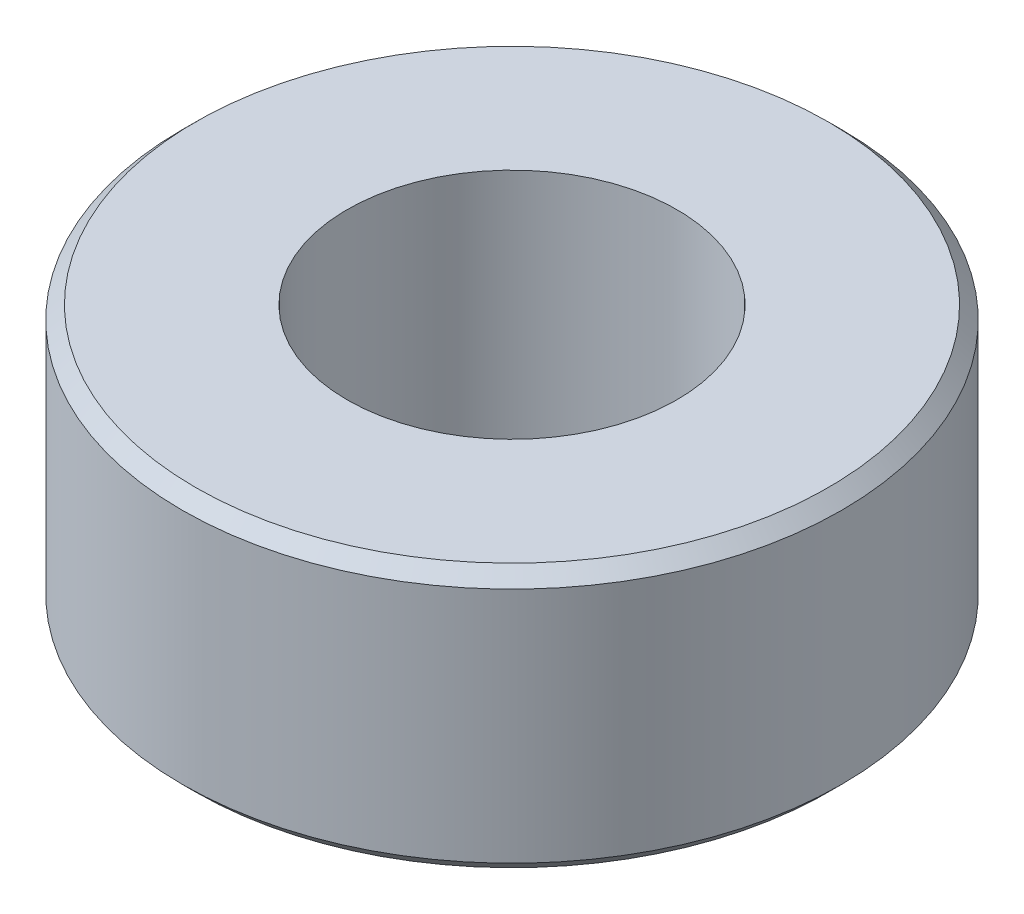
ISO-10303-21;
HEADER;
FILE_DESCRIPTION(('STEP AP214'),'2;1');
FILE_NAME('part.step','',(''),(''),'','','');
FILE_SCHEMA(('AUTOMOTIVE_DESIGN { 1 0 10303 214 1 1 1 1 }'));
ENDSEC;
DATA;
#1=APPLICATION_CONTEXT('core data for automotive mechanical design processes');
#2=APPLICATION_PROTOCOL_DEFINITION('international standard','automotive_design',2000,#1);
#3=PRODUCT_CONTEXT('',#1,'mechanical');
#4=PRODUCT('Part','Part','',(#3));
#5=PRODUCT_RELATED_PRODUCT_CATEGORY('part','',(#4));
#6=PRODUCT_DEFINITION_FORMATION('','',#4);
#7=PRODUCT_DEFINITION_CONTEXT('part definition',#1,'design');
#8=PRODUCT_DEFINITION('design','',#6,#7);
#9=PRODUCT_DEFINITION_SHAPE('','',#8);
#10=(LENGTH_UNIT() NAMED_UNIT(*) SI_UNIT(.MILLI.,.METRE.));
#11=(NAMED_UNIT(*) PLANE_ANGLE_UNIT() SI_UNIT($,.RADIAN.));
#12=(NAMED_UNIT(*) SI_UNIT($,.STERADIAN.) SOLID_ANGLE_UNIT());
#13=UNCERTAINTY_MEASURE_WITH_UNIT(LENGTH_MEASURE(1.E-05),#10,'distance_accuracy_value','');
#14=(GEOMETRIC_REPRESENTATION_CONTEXT(3) GLOBAL_UNCERTAINTY_ASSIGNED_CONTEXT((#13)) GLOBAL_UNIT_ASSIGNED_CONTEXT((#10,
#11,#12)) REPRESENTATION_CONTEXT('',''));
#15=CARTESIAN_POINT('',(0.,0.,0.));
#16=DIRECTION('',(0.,0.,1.));
#17=DIRECTION('',(1.,0.,0.));
#18=AXIS2_PLACEMENT_3D('',#15,#16,#17);
#19=CARTESIAN_POINT('',(0.,4.,0.));
#20=DIRECTION('',(0.,1.,0.));
#21=DIRECTION('',(0.,0.,1.));
#22=AXIS2_PLACEMENT_3D('',#19,#20,#21);
#23=PLANE('',#22);
#24=CARTESIAN_POINT('',(0.,4.,0.));
#25=DIRECTION('',(0.,1.,0.));
#26=DIRECTION('',(0.,0.,1.));
#27=AXIS2_PLACEMENT_3D('',#24,#25,#26);
#28=CIRCLE('',#27,4.8);
#29=CARTESIAN_POINT('',(0.,4.,4.8));
#30=VERTEX_POINT('',#29);
#31=EDGE_CURVE('E10',#30,#30,#28,.T.);
#32=ORIENTED_EDGE('',*,*,#31,.T.);
#33=EDGE_LOOP('',(#32));
#34=FACE_BOUND('',#33,.T.);
#35=CARTESIAN_POINT('',(0.,4.,0.));
#36=DIRECTION('',(0.,1.,0.));
#37=DIRECTION('',(0.,0.,1.));
#38=AXIS2_PLACEMENT_3D('',#35,#36,#37);
#39=CIRCLE('',#38,2.5);
#40=CARTESIAN_POINT('',(0.,4.,2.5));
#41=VERTEX_POINT('',#40);
#42=EDGE_CURVE('E55',#41,#41,#39,.T.);
#43=ORIENTED_EDGE('',*,*,#42,.F.);
#44=EDGE_LOOP('',(#43));
#45=FACE_BOUND('',#44,.T.);
#46=ADVANCED_FACE('F34',(#34,#45),#23,.T.);
#47=CARTESIAN_POINT('',(0.,0.,0.));
#48=DIRECTION('',(0.,1.,0.));
#49=DIRECTION('',(0.,0.,1.));
#50=AXIS2_PLACEMENT_3D('',#47,#48,#49);
#51=PLANE('',#50);
#52=CARTESIAN_POINT('',(0.,0.,0.));
#53=DIRECTION('',(0.,1.,0.));
#54=DIRECTION('',(0.,0.,1.));
#55=AXIS2_PLACEMENT_3D('',#52,#53,#54);
#56=CIRCLE('',#55,4.8);
#57=CARTESIAN_POINT('',(0.,0.,4.8));
#58=VERTEX_POINT('',#57);
#59=EDGE_CURVE('E42',#58,#58,#56,.F.);
#60=ORIENTED_EDGE('',*,*,#59,.T.);
#61=EDGE_LOOP('',(#60));
#62=FACE_BOUND('',#61,.T.);
#63=CARTESIAN_POINT('',(0.,0.,0.));
#64=DIRECTION('',(0.,1.,0.));
#65=DIRECTION('',(0.,0.,1.));
#66=AXIS2_PLACEMENT_3D('',#63,#64,#65);
#67=CIRCLE('',#66,2.5);
#68=CARTESIAN_POINT('',(0.,0.,2.5));
#69=VERTEX_POINT('',#68);
#70=EDGE_CURVE('E56',#69,#69,#67,.T.);
#71=ORIENTED_EDGE('',*,*,#70,.T.);
#72=EDGE_LOOP('',(#71));
#73=FACE_BOUND('',#72,.T.);
#74=ADVANCED_FACE('F66',(#62,#73),#51,.F.);
#75=CARTESIAN_POINT('',(0.,4.,0.));
#76=DIRECTION('',(0.,-1.,0.));
#77=DIRECTION('',(0.,0.,-1.));
#78=AXIS2_PLACEMENT_3D('',#75,#76,#77);
#79=CYLINDRICAL_SURFACE('',#78,5.);
#80=CARTESIAN_POINT('',(0.,0.200000000000001,0.));
#81=DIRECTION('',(0.,1.,0.));
#82=DIRECTION('',(0.,0.,1.));
#83=AXIS2_PLACEMENT_3D('',#80,#81,#82);
#84=CIRCLE('',#83,5.);
#85=CARTESIAN_POINT('',(0.,0.200000000000001,5.));
#86=VERTEX_POINT('',#85);
#87=EDGE_CURVE('E46',#86,#86,#84,.T.);
#88=ORIENTED_EDGE('',*,*,#87,.T.);
#89=EDGE_LOOP('',(#88));
#90=FACE_BOUND('',#89,.T.);
#91=CARTESIAN_POINT('',(0.,3.8,0.));
#92=DIRECTION('',(0.,1.,0.));
#93=DIRECTION('',(0.,0.,1.));
#94=AXIS2_PLACEMENT_3D('',#91,#92,#93);
#95=CIRCLE('',#94,5.);
#96=CARTESIAN_POINT('',(0.,3.8,5.));
#97=VERTEX_POINT('',#96);
#98=EDGE_CURVE('E50',#97,#97,#95,.F.);
#99=ORIENTED_EDGE('',*,*,#98,.T.);
#100=EDGE_LOOP('',(#99));
#101=FACE_BOUND('',#100,.T.);
#102=ADVANCED_FACE('F71',(#90,#101),#79,.T.);
#103=CARTESIAN_POINT('',(0.,4.,0.));
#104=DIRECTION('',(0.,-1.,0.));
#105=DIRECTION('',(0.,0.,-1.));
#106=AXIS2_PLACEMENT_3D('',#103,#104,#105);
#107=CYLINDRICAL_SURFACE('',#106,2.5);
#108=ORIENTED_EDGE('',*,*,#42,.T.);
#109=EDGE_LOOP('',(#108));
#110=FACE_BOUND('',#109,.T.);
#111=ORIENTED_EDGE('',*,*,#70,.F.);
#112=EDGE_LOOP('',(#111));
#113=FACE_BOUND('',#112,.T.);
#114=ADVANCED_FACE('F62',(#110,#113),#107,.F.);
#115=CARTESIAN_POINT('',(0.,0.200000000000001,0.));
#116=DIRECTION('',(0.,1.,0.));
#117=DIRECTION('',(0.,0.,1.));
#118=AXIS2_PLACEMENT_3D('',#115,#116,#117);
#119=CONICAL_SURFACE('',#118,5.,0.785398163397448);
#120=ORIENTED_EDGE('',*,*,#59,.F.);
#121=EDGE_LOOP('',(#120));
#122=FACE_BOUND('',#121,.T.);
#123=ORIENTED_EDGE('',*,*,#87,.F.);
#124=EDGE_LOOP('',(#123));
#125=FACE_BOUND('',#124,.T.);
#126=ADVANCED_FACE('F78',(#122,#125),#119,.T.);
#127=CARTESIAN_POINT('',(0.,4.,0.));
#128=DIRECTION('',(0.,-1.,0.));
#129=DIRECTION('',(0.,0.,-1.));
#130=AXIS2_PLACEMENT_3D('',#127,#128,#129);
#131=CONICAL_SURFACE('',#130,4.8,0.785398163397442);
#132=ORIENTED_EDGE('',*,*,#98,.F.);
#133=EDGE_LOOP('',(#132));
#134=FACE_BOUND('',#133,.T.);
#135=ORIENTED_EDGE('',*,*,#31,.F.);
#136=EDGE_LOOP('',(#135));
#137=FACE_BOUND('',#136,.T.);
#138=ADVANCED_FACE('F37',(#134,#137),#131,.T.);
#139=CLOSED_SHELL('',(#46,#74,#102,#114,#126,#138));
#140=MANIFOLD_SOLID_BREP('B2',#139);
#141=ADVANCED_BREP_SHAPE_REPRESENTATION('',(#18,#140),#14);
#142=SHAPE_DEFINITION_REPRESENTATION(#9,#141);
ENDSEC;
END-ISO-10303-21;
